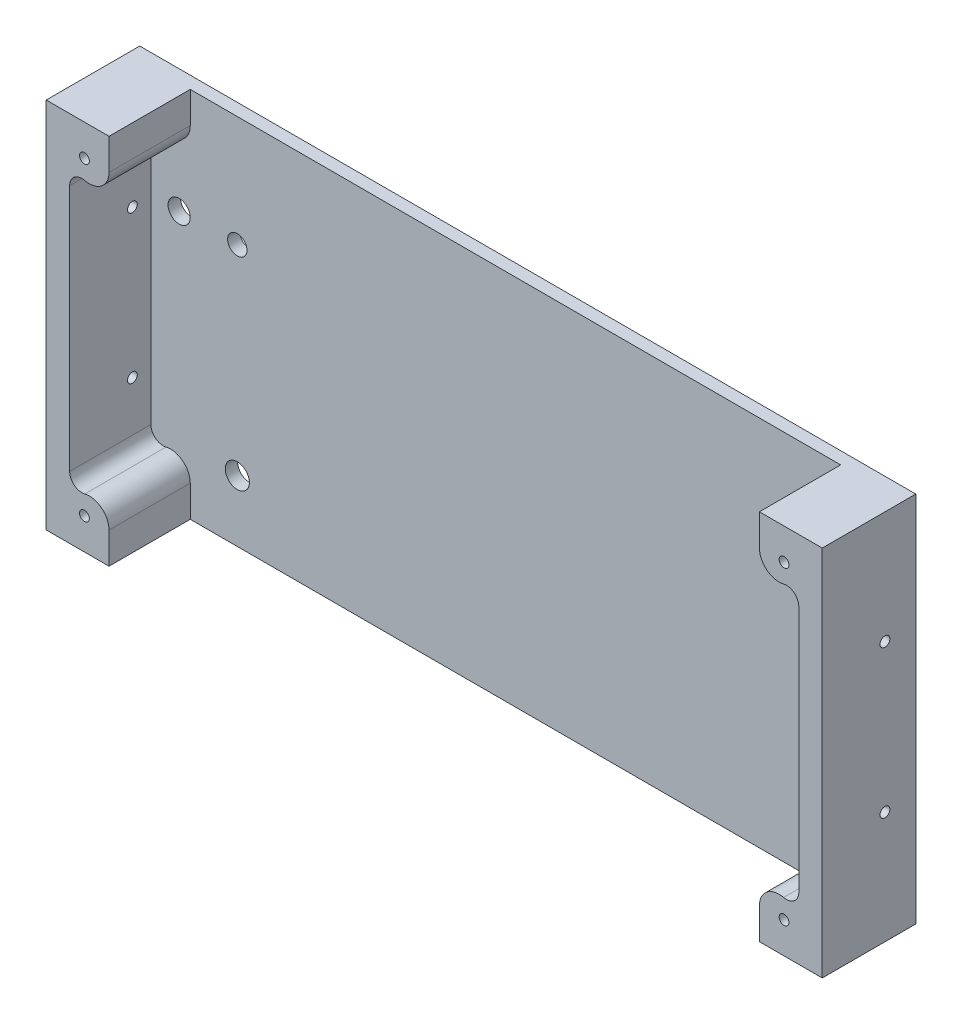
ISO-10303-21;
HEADER;
FILE_DESCRIPTION(('STEP AP214'),'2;1');
FILE_NAME('part.step','',(''),(''),'','','');
FILE_SCHEMA(('AUTOMOTIVE_DESIGN { 1 0 10303 214 1 1 1 1 }'));
ENDSEC;
DATA;
#1=APPLICATION_CONTEXT('core data for automotive mechanical design processes');
#2=APPLICATION_PROTOCOL_DEFINITION('international standard','automotive_design',2000,#1);
#3=PRODUCT_CONTEXT('',#1,'mechanical');
#4=PRODUCT('Part','Part','',(#3));
#5=PRODUCT_RELATED_PRODUCT_CATEGORY('part','',(#4));
#6=PRODUCT_DEFINITION_FORMATION('','',#4);
#7=PRODUCT_DEFINITION_CONTEXT('part definition',#1,'design');
#8=PRODUCT_DEFINITION('design','',#6,#7);
#9=PRODUCT_DEFINITION_SHAPE('','',#8);
#10=(LENGTH_UNIT() NAMED_UNIT(*) SI_UNIT(.MILLI.,.METRE.));
#11=(NAMED_UNIT(*) PLANE_ANGLE_UNIT() SI_UNIT($,.RADIAN.));
#12=(NAMED_UNIT(*) SI_UNIT($,.STERADIAN.) SOLID_ANGLE_UNIT());
#13=UNCERTAINTY_MEASURE_WITH_UNIT(LENGTH_MEASURE(1.E-05),#10,'distance_accuracy_value','');
#14=(GEOMETRIC_REPRESENTATION_CONTEXT(3) GLOBAL_UNCERTAINTY_ASSIGNED_CONTEXT((#13)) GLOBAL_UNIT_ASSIGNED_CONTEXT((#10,
#11,#12)) REPRESENTATION_CONTEXT('',''));
#15=CARTESIAN_POINT('',(0.,0.,0.));
#16=DIRECTION('',(0.,0.,1.));
#17=DIRECTION('',(1.,0.,0.));
#18=AXIS2_PLACEMENT_3D('',#15,#16,#17);
#19=CARTESIAN_POINT('',(206.607434168938,96.8446274939205,6.35));
#20=DIRECTION('',(0.,0.,1.));
#21=DIRECTION('',(1.,0.,0.));
#22=AXIS2_PLACEMENT_3D('',#19,#20,#21);
#23=PLANE('',#22);
#24=CARTESIAN_POINT('',(208.186505406018,98.304040128967,6.35));
#25=DIRECTION('',(0.,0.,1.));
#26=DIRECTION('',(1.,0.,0.));
#27=AXIS2_PLACEMENT_3D('',#24,#25,#26);
#28=CIRCLE('',#27,1.26619000000005);
#29=CARTESIAN_POINT('',(209.452695406018,98.304040128967,6.35));
#30=VERTEX_POINT('',#29);
#31=EDGE_CURVE('E19',#30,#30,#28,.F.);
#32=ORIENTED_EDGE('',*,*,#31,.F.);
#33=EDGE_LOOP('',(#32));
#34=FACE_BOUND('',#33,.T.);
#35=ADVANCED_FACE('F15',(#34),#23,.T.);
#36=CARTESIAN_POINT('',(206.894991606018,17.1041263289668,6.35));
#37=DIRECTION('',(0.,0.,1.));
#38=DIRECTION('',(1.,0.,0.));
#39=AXIS2_PLACEMENT_3D('',#36,#37,#38);
#40=PLANE('',#39);
#41=CARTESIAN_POINT('',(208.186505406018,18.3956401289667,6.35));
#42=DIRECTION('',(0.,0.,1.));
#43=DIRECTION('',(1.,0.,0.));
#44=AXIS2_PLACEMENT_3D('',#41,#42,#43);
#45=CIRCLE('',#44,1.26618999999984);
#46=CARTESIAN_POINT('',(209.452695406018,18.3956401289667,6.35));
#47=VERTEX_POINT('',#46);
#48=EDGE_CURVE('E186',#47,#47,#45,.F.);
#49=ORIENTED_EDGE('',*,*,#48,.F.);
#50=EDGE_LOOP('',(#49));
#51=FACE_BOUND('',#50,.T.);
#52=ADVANCED_FACE('F197',(#51),#40,.T.);
#53=CARTESIAN_POINT('',(206.916505406018,98.304040128967,24.13));
#54=DIRECTION('',(0.,0.,-1.));
#55=DIRECTION('',(-1.,0.,0.));
#56=AXIS2_PLACEMENT_3D('',#53,#54,#55);
#57=CYLINDRICAL_SURFACE('',#56,5.07999999999981);
#58=CARTESIAN_POINT('',(206.916505406018,98.304040128967,24.13));
#59=DIRECTION('',(0.,0.,-1.));
#60=DIRECTION('',(-1.,0.,0.));
#61=AXIS2_PLACEMENT_3D('',#58,#59,#60);
#62=CIRCLE('',#61,5.07999999999981);
#63=CARTESIAN_POINT('',(201.836505406018,98.3040401289668,24.13));
#64=VERTEX_POINT('',#63);
#65=CARTESIAN_POINT('',(208.088813098325,93.361156893996,24.13));
#66=VERTEX_POINT('',#65);
#67=EDGE_CURVE('E309',#64,#66,#62,.F.);
#68=ORIENTED_EDGE('',*,*,#67,.F.);
#69=DIRECTION('',(0.,0.,1.));
#70=VECTOR('',#69,1.);
#71=CARTESIAN_POINT('',(201.836505406018,98.3040401289667,13.6525));
#72=LINE('',#71,#70);
#73=CARTESIAN_POINT('',(201.836505406018,98.3040401289668,3.175));
#74=VERTEX_POINT('',#73);
#75=EDGE_CURVE('E361',#74,#64,#72,.T.);
#76=ORIENTED_EDGE('',*,*,#75,.F.);
#77=CARTESIAN_POINT('',(206.916505406018,98.304040128967,3.17500000000001));
#78=DIRECTION('',(0.,0.,-1.));
#79=DIRECTION('',(-1.,0.,0.));
#80=AXIS2_PLACEMENT_3D('',#77,#78,#79);
#81=CIRCLE('',#80,5.07999999999981);
#82=CARTESIAN_POINT('',(208.088813098325,93.3611568939962,3.17500000000001));
#83=VERTEX_POINT('',#82);
#84=EDGE_CURVE('E323',#83,#74,#81,.T.);
#85=ORIENTED_EDGE('',*,*,#84,.F.);
#86=DIRECTION('',(0.,0.,-1.));
#87=VECTOR('',#86,1.);
#88=CARTESIAN_POINT('',(208.088813098325,93.361156893996,13.6525));
#89=LINE('',#88,#87);
#90=EDGE_CURVE('E360',#66,#83,#89,.T.);
#91=ORIENTED_EDGE('',*,*,#90,.F.);
#92=EDGE_LOOP('',(#68,#76,#85,#91));
#93=FACE_BOUND('',#92,.T.);
#94=ADVANCED_FACE('F203',(#93),#57,.T.);
#95=CARTESIAN_POINT('',(208.821505406018,90.2718548721389,3.175));
#96=DIRECTION('',(0.,0.,1.));
#97=DIRECTION('',(1.,0.,0.));
#98=AXIS2_PLACEMENT_3D('',#95,#96,#97);
#99=CYLINDRICAL_SURFACE('',#98,3.17500000000019);
#100=CARTESIAN_POINT('',(208.821505406018,90.2718548721389,24.13));
#101=DIRECTION('',(0.,0.,1.));
#102=DIRECTION('',(1.,0.,0.));
#103=AXIS2_PLACEMENT_3D('',#100,#101,#102);
#104=CIRCLE('',#103,3.17500000000019);
#105=CARTESIAN_POINT('',(211.996505406018,90.2718548721391,24.13));
#106=VERTEX_POINT('',#105);
#107=EDGE_CURVE('E306',#66,#106,#104,.F.);
#108=ORIENTED_EDGE('',*,*,#107,.F.);
#109=ORIENTED_EDGE('',*,*,#90,.T.);
#110=CARTESIAN_POINT('',(208.821505406018,90.2718548721389,3.175));
#111=DIRECTION('',(0.,0.,1.));
#112=DIRECTION('',(1.,0.,0.));
#113=AXIS2_PLACEMENT_3D('',#110,#111,#112);
#114=CIRCLE('',#113,3.17500000000019);
#115=CARTESIAN_POINT('',(211.996505406018,90.2718548721391,3.175));
#116=VERTEX_POINT('',#115);
#117=EDGE_CURVE('E324',#116,#83,#114,.T.);
#118=ORIENTED_EDGE('',*,*,#117,.F.);
#119=DIRECTION('',(0.,0.,-1.));
#120=VECTOR('',#119,1.);
#121=CARTESIAN_POINT('',(211.996505406018,90.2718548721392,13.6525));
#122=LINE('',#121,#120);
#123=EDGE_CURVE('E358',#106,#116,#122,.T.);
#124=ORIENTED_EDGE('',*,*,#123,.F.);
#125=EDGE_LOOP('',(#108,#109,#118,#124));
#126=FACE_BOUND('',#125,.T.);
#127=ADVANCED_FACE('F453',(#126),#99,.F.);
#128=CARTESIAN_POINT('',(211.996505406018,26.4278253857947,3.175));
#129=DIRECTION('',(-1.,0.,0.));
#130=DIRECTION('',(0.,0.,1.));
#131=AXIS2_PLACEMENT_3D('',#128,#129,#130);
#132=PLANE('',#131);
#133=CARTESIAN_POINT('',(211.996505406018,39.2998401289666,7.95019999999987));
#134=DIRECTION('',(-1.,0.,0.));
#135=DIRECTION('',(0.,-1.,0.));
#136=AXIS2_PLACEMENT_3D('',#133,#134,#135);
#137=CIRCLE('',#136,1.27);
#138=CARTESIAN_POINT('',(211.996505406018,38.0298401289666,7.95019999999987));
#139=VERTEX_POINT('',#138);
#140=EDGE_CURVE('E181',#139,#139,#137,.T.);
#141=ORIENTED_EDGE('',*,*,#140,.F.);
#142=EDGE_LOOP('',(#141));
#143=FACE_BOUND('',#142,.T.);
#144=CARTESIAN_POINT('',(211.996505406018,77.3998401289666,7.95019999999987));
#145=DIRECTION('',(-1.,0.,0.));
#146=DIRECTION('',(0.,0.,1.));
#147=AXIS2_PLACEMENT_3D('',#144,#145,#146);
#148=CIRCLE('',#147,1.27);
#149=CARTESIAN_POINT('',(211.996505406018,77.3998401289666,9.22019999999987));
#150=VERTEX_POINT('',#149);
#151=EDGE_CURVE('E184',#150,#150,#148,.T.);
#152=ORIENTED_EDGE('',*,*,#151,.F.);
#153=EDGE_LOOP('',(#152));
#154=FACE_BOUND('',#153,.T.);
#155=DIRECTION('',(0.,-1.,0.));
#156=VECTOR('',#155,1.);
#157=CARTESIAN_POINT('',(211.996505406018,58.3498401289668,24.13));
#158=LINE('',#157,#156);
#159=CARTESIAN_POINT('',(211.996505406018,26.4278253857947,24.13));
#160=VERTEX_POINT('',#159);
#161=EDGE_CURVE('E305',#106,#160,#158,.T.);
#162=ORIENTED_EDGE('',*,*,#161,.F.);
#163=ORIENTED_EDGE('',*,*,#123,.T.);
#164=DIRECTION('',(0.,1.,0.));
#165=VECTOR('',#164,1.);
#166=CARTESIAN_POINT('',(211.996505406018,58.3498401289668,3.175));
#167=LINE('',#166,#165);
#168=CARTESIAN_POINT('',(211.996505406018,26.4278253857947,3.175));
#169=VERTEX_POINT('',#168);
#170=EDGE_CURVE('E172',#169,#116,#167,.T.);
#171=ORIENTED_EDGE('',*,*,#170,.F.);
#172=DIRECTION('',(0.,0.,-1.));
#173=VECTOR('',#172,1.);
#174=CARTESIAN_POINT('',(211.996505406018,26.4278253857947,13.6525));
#175=LINE('',#174,#173);
#176=EDGE_CURVE('E164',#160,#169,#175,.T.);
#177=ORIENTED_EDGE('',*,*,#176,.F.);
#178=EDGE_LOOP('',(#162,#163,#171,#177));
#179=FACE_BOUND('',#178,.T.);
#180=ADVANCED_FACE('F451',(#143,#154,#179),#132,.T.);
#181=CARTESIAN_POINT('',(208.821505406018,26.4278253857946,3.175));
#182=DIRECTION('',(0.,0.,1.));
#183=DIRECTION('',(0.,-1.,0.));
#184=AXIS2_PLACEMENT_3D('',#181,#182,#183);
#185=CYLINDRICAL_SURFACE('',#184,3.175);
#186=CARTESIAN_POINT('',(208.821505406018,26.4278253857946,24.13));
#187=DIRECTION('',(0.,0.,1.));
#188=DIRECTION('',(0.,-1.,0.));
#189=AXIS2_PLACEMENT_3D('',#186,#187,#188);
#190=CIRCLE('',#189,3.175);
#191=CARTESIAN_POINT('',(208.088813098326,23.3385233639378,24.13));
#192=VERTEX_POINT('',#191);
#193=EDGE_CURVE('E303',#160,#192,#190,.F.);
#194=ORIENTED_EDGE('',*,*,#193,.F.);
#195=ORIENTED_EDGE('',*,*,#176,.T.);
#196=CARTESIAN_POINT('',(208.821505406018,26.4278253857946,3.175));
#197=DIRECTION('',(0.,0.,1.));
#198=DIRECTION('',(0.,-1.,0.));
#199=AXIS2_PLACEMENT_3D('',#196,#197,#198);
#200=CIRCLE('',#199,3.175);
#201=CARTESIAN_POINT('',(208.088813098326,23.3385233639378,3.175));
#202=VERTEX_POINT('',#201);
#203=EDGE_CURVE('E167',#202,#169,#200,.T.);
#204=ORIENTED_EDGE('',*,*,#203,.F.);
#205=DIRECTION('',(0.,0.,-1.));
#206=VECTOR('',#205,1.);
#207=CARTESIAN_POINT('',(208.088813098326,23.3385233639378,13.6525));
#208=LINE('',#207,#206);
#209=EDGE_CURVE('E153',#192,#202,#208,.T.);
#210=ORIENTED_EDGE('',*,*,#209,.F.);
#211=EDGE_LOOP('',(#194,#195,#204,#210));
#212=FACE_BOUND('',#211,.T.);
#213=ADVANCED_FACE('F168',(#212),#185,.F.);
#214=CARTESIAN_POINT('',(206.916505406018,18.3956401289665,24.13));
#215=DIRECTION('',(0.,0.,-1.));
#216=DIRECTION('',(0.,1.,0.));
#217=AXIS2_PLACEMENT_3D('',#214,#215,#216);
#218=CYLINDRICAL_SURFACE('',#217,5.08000000000038);
#219=CARTESIAN_POINT('',(206.916505406018,18.3956401289665,24.13));
#220=DIRECTION('',(0.,0.,-1.));
#221=DIRECTION('',(0.,1.,0.));
#222=AXIS2_PLACEMENT_3D('',#219,#220,#221);
#223=CIRCLE('',#222,5.08000000000038);
#224=CARTESIAN_POINT('',(201.836505406018,18.3956401289667,24.13));
#225=VERTEX_POINT('',#224);
#226=EDGE_CURVE('E160',#192,#225,#223,.F.);
#227=ORIENTED_EDGE('',*,*,#226,.F.);
#228=ORIENTED_EDGE('',*,*,#209,.T.);
#229=CARTESIAN_POINT('',(206.916505406018,18.3956401289666,3.17499999999999));
#230=DIRECTION('',(0.,0.,-1.));
#231=DIRECTION('',(0.,1.,0.));
#232=AXIS2_PLACEMENT_3D('',#229,#230,#231);
#233=CIRCLE('',#232,5.08000000000038);
#234=CARTESIAN_POINT('',(201.836505406018,18.3956401289668,3.17499999999999));
#235=VERTEX_POINT('',#234);
#236=EDGE_CURVE('E157',#235,#202,#233,.T.);
#237=ORIENTED_EDGE('',*,*,#236,.F.);
#238=DIRECTION('',(0.,0.,-1.));
#239=VECTOR('',#238,1.);
#240=CARTESIAN_POINT('',(201.836505406018,18.3956401289669,13.6525));
#241=LINE('',#240,#239);
#242=EDGE_CURVE('E148',#225,#235,#241,.T.);
#243=ORIENTED_EDGE('',*,*,#242,.F.);
#244=EDGE_LOOP('',(#227,#228,#237,#243));
#245=FACE_BOUND('',#244,.T.);
#246=ADVANCED_FACE('F155',(#245),#218,.T.);
#247=CARTESIAN_POINT('',(208.186505406018,98.304040128967,6.35));
#248=DIRECTION('',(0.,0.,1.));
#249=DIRECTION('',(1.,0.,0.));
#250=AXIS2_PLACEMENT_3D('',#247,#248,#249);
#251=CYLINDRICAL_SURFACE('',#250,1.26619000000005);
#252=ORIENTED_EDGE('',*,*,#31,.T.);
#253=EDGE_LOOP('',(#252));
#254=FACE_BOUND('',#253,.T.);
#255=CARTESIAN_POINT('',(208.186505406018,98.304040128967,24.13));
#256=DIRECTION('',(0.,0.,1.));
#257=DIRECTION('',(1.,0.,0.));
#258=AXIS2_PLACEMENT_3D('',#255,#256,#257);
#259=CIRCLE('',#258,1.26619000000005);
#260=CARTESIAN_POINT('',(209.452695406018,98.304040128967,24.13));
#261=VERTEX_POINT('',#260);
#262=EDGE_CURVE('E298',#261,#261,#259,.F.);
#263=ORIENTED_EDGE('',*,*,#262,.F.);
#264=EDGE_LOOP('',(#263));
#265=FACE_BOUND('',#264,.T.);
#266=ADVANCED_FACE('F193',(#254,#265),#251,.F.);
#267=CARTESIAN_POINT('',(208.186505406018,18.3956401289667,6.35));
#268=DIRECTION('',(0.,0.,1.));
#269=DIRECTION('',(1.,0.,0.));
#270=AXIS2_PLACEMENT_3D('',#267,#268,#269);
#271=CYLINDRICAL_SURFACE('',#270,1.26618999999984);
#272=CARTESIAN_POINT('',(208.186505406018,18.3956401289667,24.13));
#273=DIRECTION('',(0.,0.,1.));
#274=DIRECTION('',(1.,0.,0.));
#275=AXIS2_PLACEMENT_3D('',#272,#273,#274);
#276=CIRCLE('',#275,1.26618999999984);
#277=CARTESIAN_POINT('',(209.452695406018,18.3956401289667,24.13));
#278=VERTEX_POINT('',#277);
#279=EDGE_CURVE('E295',#278,#278,#276,.F.);
#280=ORIENTED_EDGE('',*,*,#279,.F.);
#281=EDGE_LOOP('',(#280));
#282=FACE_BOUND('',#281,.T.);
#283=ORIENTED_EDGE('',*,*,#48,.T.);
#284=EDGE_LOOP('',(#283));
#285=FACE_BOUND('',#284,.T.);
#286=ADVANCED_FACE('F665',(#282,#285),#271,.F.);
#287=CARTESIAN_POINT('',(218.041705406018,77.3998401289667,7.9502));
#288=DIRECTION('',(-1.,0.,0.));
#289=DIRECTION('',(0.,0.,1.));
#290=AXIS2_PLACEMENT_3D('',#287,#288,#289);
#291=CYLINDRICAL_SURFACE('',#290,1.27);
#292=ORIENTED_EDGE('',*,*,#151,.T.);
#293=EDGE_LOOP('',(#292));
#294=FACE_BOUND('',#293,.T.);
#295=CARTESIAN_POINT('',(218.041705406018,77.3998401289667,7.9502));
#296=DIRECTION('',(-1.,0.,0.));
#297=DIRECTION('',(0.,0.,1.));
#298=AXIS2_PLACEMENT_3D('',#295,#296,#297);
#299=CIRCLE('',#298,1.27);
#300=CARTESIAN_POINT('',(218.041705406018,77.3998401289667,9.2202));
#301=VERTEX_POINT('',#300);
#302=EDGE_CURVE('E291',#301,#301,#299,.T.);
#303=ORIENTED_EDGE('',*,*,#302,.F.);
#304=EDGE_LOOP('',(#303));
#305=FACE_BOUND('',#304,.T.);
#306=ADVANCED_FACE('F657',(#294,#305),#291,.F.);
#307=CARTESIAN_POINT('',(218.041705406018,39.2998401289667,7.9502));
#308=DIRECTION('',(-1.,0.,0.));
#309=DIRECTION('',(0.,-1.,0.));
#310=AXIS2_PLACEMENT_3D('',#307,#308,#309);
#311=CYLINDRICAL_SURFACE('',#310,1.27);
#312=ORIENTED_EDGE('',*,*,#140,.T.);
#313=EDGE_LOOP('',(#312));
#314=FACE_BOUND('',#313,.T.);
#315=CARTESIAN_POINT('',(218.041705406018,39.2998401289667,7.9502));
#316=DIRECTION('',(-1.,0.,0.));
#317=DIRECTION('',(0.,-1.,0.));
#318=AXIS2_PLACEMENT_3D('',#315,#316,#317);
#319=CIRCLE('',#318,1.27);
#320=CARTESIAN_POINT('',(218.041705406018,38.0298401289667,7.9502));
#321=VERTEX_POINT('',#320);
#322=EDGE_CURVE('E288',#321,#321,#319,.T.);
#323=ORIENTED_EDGE('',*,*,#322,.F.);
#324=EDGE_LOOP('',(#323));
#325=FACE_BOUND('',#324,.T.);
#326=ADVANCED_FACE('F649',(#314,#325),#311,.F.);
#327=CARTESIAN_POINT('',(46.182355604066,77.7300401289667,0.));
#328=DIRECTION('',(0.,0.,1.));
#329=DIRECTION('',(1.,0.,0.));
#330=AXIS2_PLACEMENT_3D('',#327,#328,#329);
#331=CYLINDRICAL_SURFACE('',#330,2.49602782548072);
#332=CARTESIAN_POINT('',(46.182355604066,77.7300401289667,0.));
#333=DIRECTION('',(0.,0.,1.));
#334=DIRECTION('',(1.,0.,0.));
#335=AXIS2_PLACEMENT_3D('',#332,#333,#334);
#336=CIRCLE('',#335,2.49602782548072);
#337=CARTESIAN_POINT('',(48.6783834295467,77.7300401289667,0.));
#338=VERTEX_POINT('',#337);
#339=EDGE_CURVE('E284',#338,#338,#336,.T.);
#340=ORIENTED_EDGE('',*,*,#339,.F.);
#341=EDGE_LOOP('',(#340));
#342=FACE_BOUND('',#341,.T.);
#343=CARTESIAN_POINT('',(46.182355604066,77.7300401289667,3.175));
#344=DIRECTION('',(0.,0.,1.));
#345=DIRECTION('',(1.,0.,0.));
#346=AXIS2_PLACEMENT_3D('',#343,#344,#345);
#347=CIRCLE('',#346,2.49602782548072);
#348=CARTESIAN_POINT('',(48.6783834295467,77.7300401289667,3.175));
#349=VERTEX_POINT('',#348);
#350=EDGE_CURVE('E313',#349,#349,#347,.F.);
#351=ORIENTED_EDGE('',*,*,#350,.F.);
#352=EDGE_LOOP('',(#351));
#353=FACE_BOUND('',#352,.T.);
#354=ADVANCED_FACE('F641',(#342,#353),#331,.F.);
#355=CARTESIAN_POINT('',(46.182355604066,26.1426401289667,0.));
#356=DIRECTION('',(0.,0.,1.));
#357=DIRECTION('',(1.,0.,0.));
#358=AXIS2_PLACEMENT_3D('',#355,#356,#357);
#359=CYLINDRICAL_SURFACE('',#358,3.1115);
#360=CARTESIAN_POINT('',(46.182355604066,26.1426401289667,0.));
#361=DIRECTION('',(0.,0.,1.));
#362=DIRECTION('',(1.,0.,0.));
#363=AXIS2_PLACEMENT_3D('',#360,#361,#362);
#364=CIRCLE('',#363,3.1115);
#365=CARTESIAN_POINT('',(49.293855604066,26.1426401289667,0.));
#366=VERTEX_POINT('',#365);
#367=EDGE_CURVE('E281',#366,#366,#364,.T.);
#368=ORIENTED_EDGE('',*,*,#367,.F.);
#369=EDGE_LOOP('',(#368));
#370=FACE_BOUND('',#369,.T.);
#371=CARTESIAN_POINT('',(46.182355604066,26.1426401289667,3.175));
#372=DIRECTION('',(0.,0.,1.));
#373=DIRECTION('',(1.,0.,0.));
#374=AXIS2_PLACEMENT_3D('',#371,#372,#373);
#375=CIRCLE('',#374,3.1115);
#376=CARTESIAN_POINT('',(49.293855604066,26.1426401289667,3.175));
#377=VERTEX_POINT('',#376);
#378=EDGE_CURVE('E317',#377,#377,#375,.F.);
#379=ORIENTED_EDGE('',*,*,#378,.F.);
#380=EDGE_LOOP('',(#379));
#381=FACE_BOUND('',#380,.T.);
#382=ADVANCED_FACE('F633',(#370,#381),#359,.F.);
#383=CARTESIAN_POINT('',(31.178575604066,77.7300401289667,0.));
#384=DIRECTION('',(0.,0.,1.));
#385=DIRECTION('',(1.,0.,0.));
#386=AXIS2_PLACEMENT_3D('',#383,#384,#385);
#387=CYLINDRICAL_SURFACE('',#386,2.864203424347);
#388=CARTESIAN_POINT('',(31.178575604066,77.7300401289667,0.));
#389=DIRECTION('',(0.,0.,1.));
#390=DIRECTION('',(1.,0.,0.));
#391=AXIS2_PLACEMENT_3D('',#388,#389,#390);
#392=CIRCLE('',#391,2.864203424347);
#393=CARTESIAN_POINT('',(34.042779028413,77.7300401289667,0.));
#394=VERTEX_POINT('',#393);
#395=EDGE_CURVE('E278',#394,#394,#392,.T.);
#396=ORIENTED_EDGE('',*,*,#395,.F.);
#397=EDGE_LOOP('',(#396));
#398=FACE_BOUND('',#397,.T.);
#399=CARTESIAN_POINT('',(31.178575604066,77.7300401289667,3.175));
#400=DIRECTION('',(0.,0.,1.));
#401=DIRECTION('',(1.,0.,0.));
#402=AXIS2_PLACEMENT_3D('',#399,#400,#401);
#403=CIRCLE('',#402,2.864203424347);
#404=CARTESIAN_POINT('',(34.042779028413,77.7300401289667,3.175));
#405=VERTEX_POINT('',#404);
#406=EDGE_CURVE('E320',#405,#405,#403,.F.);
#407=ORIENTED_EDGE('',*,*,#406,.F.);
#408=EDGE_LOOP('',(#407));
#409=FACE_BOUND('',#408,.T.);
#410=ADVANCED_FACE('F626',(#398,#409),#387,.F.);
#411=CARTESIAN_POINT('',(201.836505406018,10.3184401289668,3.175));
#412=DIRECTION('',(-1.,0.,0.));
#413=DIRECTION('',(0.,0.,1.));
#414=AXIS2_PLACEMENT_3D('',#411,#412,#413);
#415=PLANE('',#414);
#416=DIRECTION('',(0.,-1.,0.));
#417=VECTOR('',#416,1.);
#418=CARTESIAN_POINT('',(201.836505406018,58.3498401289668,24.13));
#419=LINE('',#418,#417);
#420=CARTESIAN_POINT('',(201.836505406018,10.3184401289668,24.13));
#421=VERTEX_POINT('',#420);
#422=EDGE_CURVE('E301',#225,#421,#419,.T.);
#423=ORIENTED_EDGE('',*,*,#422,.F.);
#424=ORIENTED_EDGE('',*,*,#242,.T.);
#425=DIRECTION('',(0.,1.,0.));
#426=VECTOR('',#425,1.);
#427=CARTESIAN_POINT('',(201.836505406018,58.3498401289668,3.175));
#428=LINE('',#427,#426);
#429=CARTESIAN_POINT('',(201.836505406018,10.3184401289668,3.175));
#430=VERTEX_POINT('',#429);
#431=EDGE_CURVE('E176',#430,#235,#428,.T.);
#432=ORIENTED_EDGE('',*,*,#431,.F.);
#433=DIRECTION('',(0.,0.,-1.));
#434=VECTOR('',#433,1.);
#435=CARTESIAN_POINT('',(201.836505406018,10.3184401289668,12.065));
#436=LINE('',#435,#434);
#437=EDGE_CURVE('E344',#421,#430,#436,.T.);
#438=ORIENTED_EDGE('',*,*,#437,.F.);
#439=EDGE_LOOP('',(#423,#424,#432,#438));
#440=FACE_BOUND('',#439,.T.);
#441=ADVANCED_FACE('F445',(#440),#415,.T.);
#442=CARTESIAN_POINT('',(17.8389054060178,77.3998401289667,7.9502));
#443=DIRECTION('',(1.,0.,0.));
#444=DIRECTION('',(0.,0.,-1.));
#445=AXIS2_PLACEMENT_3D('',#442,#443,#444);
#446=CYLINDRICAL_SURFACE('',#445,1.27);
#447=CARTESIAN_POINT('',(23.8841054060178,77.3998401289667,7.9502));
#448=DIRECTION('',(1.,0.,0.));
#449=DIRECTION('',(0.,0.,-1.));
#450=AXIS2_PLACEMENT_3D('',#447,#448,#449);
#451=CIRCLE('',#450,1.27);
#452=CARTESIAN_POINT('',(23.8841054060178,77.3998401289667,6.6802));
#453=VERTEX_POINT('',#452);
#454=EDGE_CURVE('E257',#453,#453,#451,.F.);
#455=ORIENTED_EDGE('',*,*,#454,.F.);
#456=EDGE_LOOP('',(#455));
#457=FACE_BOUND('',#456,.T.);
#458=CARTESIAN_POINT('',(17.8389054060178,77.3998401289667,7.9502));
#459=DIRECTION('',(1.,0.,0.));
#460=DIRECTION('',(0.,0.,-1.));
#461=AXIS2_PLACEMENT_3D('',#458,#459,#460);
#462=CIRCLE('',#461,1.27);
#463=CARTESIAN_POINT('',(17.8389054060178,77.3998401289667,6.6802));
#464=VERTEX_POINT('',#463);
#465=EDGE_CURVE('E270',#464,#464,#462,.T.);
#466=ORIENTED_EDGE('',*,*,#465,.F.);
#467=EDGE_LOOP('',(#466));
#468=FACE_BOUND('',#467,.T.);
#469=ADVANCED_FACE('F611',(#457,#468),#446,.F.);
#470=CARTESIAN_POINT('',(17.8389054060178,39.2998401289667,7.9502));
#471=DIRECTION('',(1.,0.,0.));
#472=DIRECTION('',(0.,0.,-1.));
#473=AXIS2_PLACEMENT_3D('',#470,#471,#472);
#474=CYLINDRICAL_SURFACE('',#473,1.27);
#475=CARTESIAN_POINT('',(23.8841054060177,39.2998401289667,7.9502));
#476=DIRECTION('',(1.,0.,0.));
#477=DIRECTION('',(0.,0.,-1.));
#478=AXIS2_PLACEMENT_3D('',#475,#476,#477);
#479=CIRCLE('',#478,1.27);
#480=CARTESIAN_POINT('',(23.8841054060177,39.2998401289667,6.6802));
#481=VERTEX_POINT('',#480);
#482=EDGE_CURVE('E254',#481,#481,#479,.F.);
#483=ORIENTED_EDGE('',*,*,#482,.F.);
#484=EDGE_LOOP('',(#483));
#485=FACE_BOUND('',#484,.T.);
#486=CARTESIAN_POINT('',(17.8389054060178,39.2998401289667,7.9502));
#487=DIRECTION('',(1.,0.,0.));
#488=DIRECTION('',(0.,0.,-1.));
#489=AXIS2_PLACEMENT_3D('',#486,#487,#488);
#490=CIRCLE('',#489,1.27);
#491=CARTESIAN_POINT('',(17.8389054060178,39.2998401289667,6.6802));
#492=VERTEX_POINT('',#491);
#493=EDGE_CURVE('E274',#492,#492,#490,.T.);
#494=ORIENTED_EDGE('',*,*,#493,.F.);
#495=EDGE_LOOP('',(#494));
#496=FACE_BOUND('',#495,.T.);
#497=ADVANCED_FACE('F603',(#485,#496),#474,.F.);
#498=CARTESIAN_POINT('',(23.8841054060177,10.3184401289668,3.175));
#499=DIRECTION('',(0.,0.,1.));
#500=DIRECTION('',(1.,0.,0.));
#501=AXIS2_PLACEMENT_3D('',#498,#499,#500);
#502=PLANE('',#501);
#503=ORIENTED_EDGE('',*,*,#350,.T.);
#504=EDGE_LOOP('',(#503));
#505=FACE_BOUND('',#504,.T.);
#506=ORIENTED_EDGE('',*,*,#378,.T.);
#507=EDGE_LOOP('',(#506));
#508=FACE_BOUND('',#507,.T.);
#509=ORIENTED_EDGE('',*,*,#406,.T.);
#510=EDGE_LOOP('',(#509));
#511=FACE_BOUND('',#510,.T.);
#512=CARTESIAN_POINT('',(28.9641054060177,18.3956401289668,3.175));
#513=DIRECTION('',(0.,0.,-1.));
#514=DIRECTION('',(-1.,0.,0.));
#515=AXIS2_PLACEMENT_3D('',#512,#513,#514);
#516=CIRCLE('',#515,5.08000000000005);
#517=CARTESIAN_POINT('',(34.0441054060178,18.3956401289668,3.175));
#518=VERTEX_POINT('',#517);
#519=CARTESIAN_POINT('',(27.79179771371,23.3385233639377,3.175));
#520=VERTEX_POINT('',#519);
#521=EDGE_CURVE('E266',#518,#520,#516,.F.);
#522=ORIENTED_EDGE('',*,*,#521,.F.);
#523=DIRECTION('',(0.,1.,0.));
#524=VECTOR('',#523,1.);
#525=CARTESIAN_POINT('',(34.0441054060178,14.3570401289668,3.175));
#526=LINE('',#525,#524);
#527=CARTESIAN_POINT('',(34.0441054060178,10.3184401289668,3.175));
#528=VERTEX_POINT('',#527);
#529=EDGE_CURVE('E338',#528,#518,#526,.T.);
#530=ORIENTED_EDGE('',*,*,#529,.F.);
#531=DIRECTION('',(-1.,0.,0.));
#532=VECTOR('',#531,1.);
#533=CARTESIAN_POINT('',(117.940305406018,10.3184401289668,3.175));
#534=LINE('',#533,#532);
#535=EDGE_CURVE('E341',#430,#528,#534,.T.);
#536=ORIENTED_EDGE('',*,*,#535,.F.);
#537=ORIENTED_EDGE('',*,*,#431,.T.);
#538=ORIENTED_EDGE('',*,*,#236,.T.);
#539=ORIENTED_EDGE('',*,*,#203,.T.);
#540=ORIENTED_EDGE('',*,*,#170,.T.);
#541=ORIENTED_EDGE('',*,*,#117,.T.);
#542=ORIENTED_EDGE('',*,*,#84,.T.);
#543=DIRECTION('',(0.,-1.,0.));
#544=VECTOR('',#543,1.);
#545=CARTESIAN_POINT('',(201.836505406018,102.342640128967,3.175));
#546=LINE('',#545,#544);
#547=CARTESIAN_POINT('',(201.836505406018,106.381240128967,3.175));
#548=VERTEX_POINT('',#547);
#549=EDGE_CURVE('E316',#548,#74,#546,.T.);
#550=ORIENTED_EDGE('',*,*,#549,.F.);
#551=DIRECTION('',(1.,0.,0.));
#552=VECTOR('',#551,1.);
#553=CARTESIAN_POINT('',(117.940305406018,106.381240128967,3.175));
#554=LINE('',#553,#552);
#555=CARTESIAN_POINT('',(34.0441054060178,106.381240128967,3.175));
#556=VERTEX_POINT('',#555);
#557=EDGE_CURVE('E329',#556,#548,#554,.T.);
#558=ORIENTED_EDGE('',*,*,#557,.F.);
#559=DIRECTION('',(0.,1.,0.));
#560=VECTOR('',#559,1.);
#561=CARTESIAN_POINT('',(34.0441054060178,102.342640128967,3.175));
#562=LINE('',#561,#560);
#563=CARTESIAN_POINT('',(34.0441054060177,98.3040401289667,3.17500000000001));
#564=VERTEX_POINT('',#563);
#565=EDGE_CURVE('E332',#564,#556,#562,.T.);
#566=ORIENTED_EDGE('',*,*,#565,.F.);
#567=CARTESIAN_POINT('',(28.9641054060177,98.3040401289668,3.17500000000001));
#568=DIRECTION('',(0.,0.,-1.));
#569=DIRECTION('',(0.,1.,0.));
#570=AXIS2_PLACEMENT_3D('',#567,#568,#569);
#571=CIRCLE('',#570,5.07999999999987);
#572=CARTESIAN_POINT('',(27.7917977137101,93.361156893996,3.175));
#573=VERTEX_POINT('',#572);
#574=EDGE_CURVE('E246',#573,#564,#571,.F.);
#575=ORIENTED_EDGE('',*,*,#574,.F.);
#576=CARTESIAN_POINT('',(27.059105406018,90.2718548721388,3.175));
#577=DIRECTION('',(0.,0.,1.));
#578=DIRECTION('',(1.,0.,0.));
#579=AXIS2_PLACEMENT_3D('',#576,#577,#578);
#580=CIRCLE('',#579,3.17500000000042);
#581=CARTESIAN_POINT('',(23.8841054060178,90.2718548721389,3.175));
#582=VERTEX_POINT('',#581);
#583=EDGE_CURVE('E251',#582,#573,#580,.F.);
#584=ORIENTED_EDGE('',*,*,#583,.F.);
#585=DIRECTION('',(0.,1.,0.));
#586=VECTOR('',#585,1.);
#587=CARTESIAN_POINT('',(23.8841054060178,58.3498401289668,3.175));
#588=LINE('',#587,#586);
#589=CARTESIAN_POINT('',(23.8841054060177,26.4278253857944,3.175));
#590=VERTEX_POINT('',#589);
#591=EDGE_CURVE('E335',#590,#582,#588,.T.);
#592=ORIENTED_EDGE('',*,*,#591,.F.);
#593=CARTESIAN_POINT('',(27.0591054060176,26.4278253857944,3.175));
#594=DIRECTION('',(0.,0.,1.));
#595=DIRECTION('',(1.,0.,0.));
#596=AXIS2_PLACEMENT_3D('',#593,#594,#595);
#597=CIRCLE('',#596,3.17499999999995);
#598=EDGE_CURVE('E261',#520,#590,#597,.F.);
#599=ORIENTED_EDGE('',*,*,#598,.F.);
#600=EDGE_LOOP('',(#522,#530,#536,#537,#538,#539,#540,#541,#542,#550,#558,#566,#575,#584,#592,#599));
#601=FACE_BOUND('',#600,.T.);
#602=ADVANCED_FACE('F174',(#505,#508,#511,#601),#502,.T.);
#603=CARTESIAN_POINT('',(201.836505406018,98.3040401289667,3.175));
#604=DIRECTION('',(-1.,0.,0.));
#605=DIRECTION('',(0.,0.,1.));
#606=AXIS2_PLACEMENT_3D('',#603,#604,#605);
#607=PLANE('',#606);
#608=DIRECTION('',(0.,-1.,0.));
#609=VECTOR('',#608,1.);
#610=CARTESIAN_POINT('',(201.836505406018,58.3498401289668,24.13));
#611=LINE('',#610,#609);
#612=CARTESIAN_POINT('',(201.836505406018,106.381240128967,24.13));
#613=VERTEX_POINT('',#612);
#614=EDGE_CURVE('E312',#613,#64,#611,.T.);
#615=ORIENTED_EDGE('',*,*,#614,.F.);
#616=DIRECTION('',(0.,0.,1.));
#617=VECTOR('',#616,1.);
#618=CARTESIAN_POINT('',(201.836505406018,106.381240128967,12.065));
#619=LINE('',#618,#617);
#620=EDGE_CURVE('E370',#548,#613,#619,.T.);
#621=ORIENTED_EDGE('',*,*,#620,.F.);
#622=ORIENTED_EDGE('',*,*,#549,.T.);
#623=ORIENTED_EDGE('',*,*,#75,.T.);
#624=EDGE_LOOP('',(#615,#621,#622,#623));
#625=FACE_BOUND('',#624,.T.);
#626=ADVANCED_FACE('F457',(#625),#607,.T.);
#627=CARTESIAN_POINT('',(201.836505406018,10.3184401289668,24.13));
#628=DIRECTION('',(0.,0.,1.));
#629=DIRECTION('',(1.,0.,0.));
#630=AXIS2_PLACEMENT_3D('',#627,#628,#629);
#631=PLANE('',#630);
#632=ORIENTED_EDGE('',*,*,#279,.T.);
#633=EDGE_LOOP('',(#632));
#634=FACE_BOUND('',#633,.T.);
#635=ORIENTED_EDGE('',*,*,#262,.T.);
#636=EDGE_LOOP('',(#635));
#637=FACE_BOUND('',#636,.T.);
#638=DIRECTION('',(0.,-1.,0.));
#639=VECTOR('',#638,1.);
#640=CARTESIAN_POINT('',(218.041705406018,58.3498401289668,24.13));
#641=LINE('',#640,#639);
#642=CARTESIAN_POINT('',(218.041705406018,106.381240128967,24.13));
#643=VERTEX_POINT('',#642);
#644=CARTESIAN_POINT('',(218.041705406018,10.3184401289668,24.13));
#645=VERTEX_POINT('',#644);
#646=EDGE_CURVE('E294',#643,#645,#641,.T.);
#647=ORIENTED_EDGE('',*,*,#646,.F.);
#648=DIRECTION('',(1.,0.,0.));
#649=VECTOR('',#648,1.);
#650=CARTESIAN_POINT('',(117.940305406018,106.381240128967,24.13));
#651=LINE('',#650,#649);
#652=EDGE_CURVE('E372',#613,#643,#651,.T.);
#653=ORIENTED_EDGE('',*,*,#652,.F.);
#654=ORIENTED_EDGE('',*,*,#614,.T.);
#655=ORIENTED_EDGE('',*,*,#67,.T.);
#656=ORIENTED_EDGE('',*,*,#107,.T.);
#657=ORIENTED_EDGE('',*,*,#161,.T.);
#658=ORIENTED_EDGE('',*,*,#193,.T.);
#659=ORIENTED_EDGE('',*,*,#226,.T.);
#660=ORIENTED_EDGE('',*,*,#422,.T.);
#661=DIRECTION('',(-1.,0.,0.));
#662=VECTOR('',#661,1.);
#663=CARTESIAN_POINT('',(117.940305406018,10.3184401289668,24.13));
#664=LINE('',#663,#662);
#665=EDGE_CURVE('E347',#645,#421,#664,.T.);
#666=ORIENTED_EDGE('',*,*,#665,.F.);
#667=EDGE_LOOP('',(#647,#653,#654,#655,#656,#657,#658,#659,#660,#666));
#668=FACE_BOUND('',#667,.T.);
#669=ADVANCED_FACE('F447',(#634,#637,#668),#631,.T.);
#670=CARTESIAN_POINT('',(218.041705406018,10.3184401289668,24.13));
#671=DIRECTION('',(1.,0.,0.));
#672=DIRECTION('',(0.,0.,-1.));
#673=AXIS2_PLACEMENT_3D('',#670,#671,#672);
#674=PLANE('',#673);
#675=ORIENTED_EDGE('',*,*,#322,.T.);
#676=EDGE_LOOP('',(#675));
#677=FACE_BOUND('',#676,.T.);
#678=ORIENTED_EDGE('',*,*,#302,.T.);
#679=EDGE_LOOP('',(#678));
#680=FACE_BOUND('',#679,.T.);
#681=DIRECTION('',(0.,0.,-1.));
#682=VECTOR('',#681,1.);
#683=CARTESIAN_POINT('',(218.041705406018,106.381240128967,12.065));
#684=LINE('',#683,#682);
#685=CARTESIAN_POINT('',(218.041705406018,106.381240128967,0.));
#686=VERTEX_POINT('',#685);
#687=EDGE_CURVE('E379',#643,#686,#684,.T.);
#688=ORIENTED_EDGE('',*,*,#687,.F.);
#689=ORIENTED_EDGE('',*,*,#646,.T.);
#690=DIRECTION('',(0.,0.,1.));
#691=VECTOR('',#690,1.);
#692=CARTESIAN_POINT('',(218.041705406018,10.3184401289668,12.065));
#693=LINE('',#692,#691);
#694=CARTESIAN_POINT('',(218.041705406018,10.3184401289668,0.));
#695=VERTEX_POINT('',#694);
#696=EDGE_CURVE('E350',#695,#645,#693,.T.);
#697=ORIENTED_EDGE('',*,*,#696,.F.);
#698=DIRECTION('',(0.,-1.,0.));
#699=VECTOR('',#698,1.);
#700=CARTESIAN_POINT('',(218.041705406018,58.3498401289668,0.));
#701=LINE('',#700,#699);
#702=EDGE_CURVE('E287',#686,#695,#701,.T.);
#703=ORIENTED_EDGE('',*,*,#702,.F.);
#704=EDGE_LOOP('',(#688,#689,#697,#703));
#705=FACE_BOUND('',#704,.T.);
#706=ADVANCED_FACE('F472',(#677,#680,#705),#674,.T.);
#707=CARTESIAN_POINT('',(218.041705406018,10.3184401289668,0.));
#708=DIRECTION('',(0.,0.,-1.));
#709=DIRECTION('',(-1.,0.,0.));
#710=AXIS2_PLACEMENT_3D('',#707,#708,#709);
#711=PLANE('',#710);
#712=ORIENTED_EDGE('',*,*,#395,.T.);
#713=EDGE_LOOP('',(#712));
#714=FACE_BOUND('',#713,.T.);
#715=ORIENTED_EDGE('',*,*,#367,.T.);
#716=EDGE_LOOP('',(#715));
#717=FACE_BOUND('',#716,.T.);
#718=ORIENTED_EDGE('',*,*,#339,.T.);
#719=EDGE_LOOP('',(#718));
#720=FACE_BOUND('',#719,.T.);
#721=DIRECTION('',(-1.,0.,0.));
#722=VECTOR('',#721,1.);
#723=CARTESIAN_POINT('',(117.940305406018,106.381240128967,0.));
#724=LINE('',#723,#722);
#725=CARTESIAN_POINT('',(17.8389054060178,106.381240128967,0.));
#726=VERTEX_POINT('',#725);
#727=EDGE_CURVE('E383',#686,#726,#724,.T.);
#728=ORIENTED_EDGE('',*,*,#727,.F.);
#729=ORIENTED_EDGE('',*,*,#702,.T.);
#730=DIRECTION('',(1.,0.,0.));
#731=VECTOR('',#730,1.);
#732=CARTESIAN_POINT('',(117.940305406018,10.3184401289668,0.));
#733=LINE('',#732,#731);
#734=CARTESIAN_POINT('',(17.8389054060178,10.3184401289668,0.));
#735=VERTEX_POINT('',#734);
#736=EDGE_CURVE('E353',#735,#695,#733,.T.);
#737=ORIENTED_EDGE('',*,*,#736,.F.);
#738=DIRECTION('',(0.,-1.,0.));
#739=VECTOR('',#738,1.);
#740=CARTESIAN_POINT('',(17.8389054060178,58.3498401289668,0.));
#741=LINE('',#740,#739);
#742=EDGE_CURVE('E277',#726,#735,#741,.T.);
#743=ORIENTED_EDGE('',*,*,#742,.F.);
#744=EDGE_LOOP('',(#728,#729,#737,#743));
#745=FACE_BOUND('',#744,.T.);
#746=ADVANCED_FACE('F469',(#714,#717,#720,#745),#711,.T.);
#747=CARTESIAN_POINT('',(26.4279154060178,97.0125263289667,6.35));
#748=DIRECTION('',(0.,0.,1.));
#749=DIRECTION('',(1.,0.,0.));
#750=AXIS2_PLACEMENT_3D('',#747,#748,#749);
#751=PLANE('',#750);
#752=CARTESIAN_POINT('',(27.6941054060178,98.3040401289666,6.35));
#753=DIRECTION('',(0.,0.,-1.));
#754=DIRECTION('',(-1.,0.,0.));
#755=AXIS2_PLACEMENT_3D('',#752,#753,#754);
#756=CIRCLE('',#755,1.26619000000001);
#757=CARTESIAN_POINT('',(26.4279154060178,98.3040401289666,6.34999999999999));
#758=VERTEX_POINT('',#757);
#759=EDGE_CURVE('E241',#758,#758,#756,.T.);
#760=ORIENTED_EDGE('',*,*,#759,.F.);
#761=EDGE_LOOP('',(#760));
#762=FACE_BOUND('',#761,.T.);
#763=ADVANCED_FACE('F480',(#762),#751,.T.);
#764=CARTESIAN_POINT('',(17.8389054060178,10.3184401289668,0.));
#765=DIRECTION('',(-1.,0.,0.));
#766=DIRECTION('',(0.,0.,1.));
#767=AXIS2_PLACEMENT_3D('',#764,#765,#766);
#768=PLANE('',#767);
#769=ORIENTED_EDGE('',*,*,#465,.T.);
#770=EDGE_LOOP('',(#769));
#771=FACE_BOUND('',#770,.T.);
#772=ORIENTED_EDGE('',*,*,#493,.T.);
#773=EDGE_LOOP('',(#772));
#774=FACE_BOUND('',#773,.T.);
#775=DIRECTION('',(0.,0.,-1.));
#776=VECTOR('',#775,1.);
#777=CARTESIAN_POINT('',(17.8389054060178,10.3184401289668,12.065));
#778=LINE('',#777,#776);
#779=CARTESIAN_POINT('',(17.8389054060178,10.3184401289668,24.13));
#780=VERTEX_POINT('',#779);
#781=EDGE_CURVE('E273',#780,#735,#778,.T.);
#782=ORIENTED_EDGE('',*,*,#781,.F.);
#783=DIRECTION('',(0.,-1.,0.));
#784=VECTOR('',#783,1.);
#785=CARTESIAN_POINT('',(17.8389054060178,58.3498401289668,24.13));
#786=LINE('',#785,#784);
#787=CARTESIAN_POINT('',(17.8389054060178,106.381240128967,24.13));
#788=VERTEX_POINT('',#787);
#789=EDGE_CURVE('E244',#788,#780,#786,.T.);
#790=ORIENTED_EDGE('',*,*,#789,.F.);
#791=DIRECTION('',(0.,0.,1.));
#792=VECTOR('',#791,1.);
#793=CARTESIAN_POINT('',(17.8389054060178,106.381240128967,12.065));
#794=LINE('',#793,#792);
#795=EDGE_CURVE('E245',#726,#788,#794,.T.);
#796=ORIENTED_EDGE('',*,*,#795,.F.);
#797=ORIENTED_EDGE('',*,*,#742,.T.);
#798=EDGE_LOOP('',(#782,#790,#796,#797));
#799=FACE_BOUND('',#798,.T.);
#800=ADVANCED_FACE('F465',(#771,#774,#799),#768,.T.);
#801=CARTESIAN_POINT('',(17.8389054060178,10.3184401289668,24.13));
#802=DIRECTION('',(0.,-1.,0.));
#803=DIRECTION('',(0.,0.,-1.));
#804=AXIS2_PLACEMENT_3D('',#801,#802,#803);
#805=PLANE('',#804);
#806=DIRECTION('',(0.,0.,-1.));
#807=VECTOR('',#806,1.);
#808=CARTESIAN_POINT('',(34.0441054060177,10.3184401289668,13.6525));
#809=LINE('',#808,#807);
#810=CARTESIAN_POINT('',(34.0441054060178,10.3184401289668,24.13));
#811=VERTEX_POINT('',#810);
#812=EDGE_CURVE('E269',#811,#528,#809,.T.);
#813=ORIENTED_EDGE('',*,*,#812,.F.);
#814=DIRECTION('',(1.,0.,0.));
#815=VECTOR('',#814,1.);
#816=CARTESIAN_POINT('',(25.9415054060178,10.3184401289668,24.13));
#817=LINE('',#816,#815);
#818=EDGE_CURVE('E392',#780,#811,#817,.T.);
#819=ORIENTED_EDGE('',*,*,#818,.F.);
#820=ORIENTED_EDGE('',*,*,#781,.T.);
#821=ORIENTED_EDGE('',*,*,#736,.T.);
#822=ORIENTED_EDGE('',*,*,#696,.T.);
#823=ORIENTED_EDGE('',*,*,#665,.T.);
#824=ORIENTED_EDGE('',*,*,#437,.T.);
#825=ORIENTED_EDGE('',*,*,#535,.T.);
#826=EDGE_LOOP('',(#813,#819,#820,#821,#822,#823,#824,#825));
#827=FACE_BOUND('',#826,.T.);
#828=ADVANCED_FACE('F442',(#827),#805,.T.);
#829=CARTESIAN_POINT('',(34.0441054060178,10.3184401289668,24.13));
#830=DIRECTION('',(1.,0.,0.));
#831=DIRECTION('',(0.,0.,-1.));
#832=AXIS2_PLACEMENT_3D('',#829,#830,#831);
#833=PLANE('',#832);
#834=DIRECTION('',(0.,1.,0.));
#835=VECTOR('',#834,1.);
#836=CARTESIAN_POINT('',(34.0441054060178,58.3498401289668,24.13));
#837=LINE('',#836,#835);
#838=CARTESIAN_POINT('',(34.0441054060178,18.3956401289668,24.13));
#839=VERTEX_POINT('',#838);
#840=EDGE_CURVE('E240',#811,#839,#837,.T.);
#841=ORIENTED_EDGE('',*,*,#840,.F.);
#842=ORIENTED_EDGE('',*,*,#812,.T.);
#843=ORIENTED_EDGE('',*,*,#529,.T.);
#844=DIRECTION('',(0.,0.,-1.));
#845=VECTOR('',#844,1.);
#846=CARTESIAN_POINT('',(34.0441054060178,18.3956401289668,13.6525));
#847=LINE('',#846,#845);
#848=EDGE_CURVE('E265',#839,#518,#847,.T.);
#849=ORIENTED_EDGE('',*,*,#848,.F.);
#850=EDGE_LOOP('',(#841,#842,#843,#849));
#851=FACE_BOUND('',#850,.T.);
#852=ADVANCED_FACE('F439',(#851),#833,.T.);
#853=CARTESIAN_POINT('',(28.9641054060177,18.3956401289668,24.13));
#854=DIRECTION('',(0.,0.,-1.));
#855=DIRECTION('',(-1.,0.,0.));
#856=AXIS2_PLACEMENT_3D('',#853,#854,#855);
#857=CYLINDRICAL_SURFACE('',#856,5.08000000000005);
#858=CARTESIAN_POINT('',(28.9641054060177,18.3956401289668,24.13));
#859=DIRECTION('',(0.,0.,-1.));
#860=DIRECTION('',(-1.,0.,0.));
#861=AXIS2_PLACEMENT_3D('',#858,#859,#860);
#862=CIRCLE('',#861,5.08000000000005);
#863=CARTESIAN_POINT('',(27.79179771371,23.3385233639377,24.13));
#864=VERTEX_POINT('',#863);
#865=EDGE_CURVE('E237',#839,#864,#862,.F.);
#866=ORIENTED_EDGE('',*,*,#865,.F.);
#867=ORIENTED_EDGE('',*,*,#848,.T.);
#868=ORIENTED_EDGE('',*,*,#521,.T.);
#869=DIRECTION('',(0.,0.,-1.));
#870=VECTOR('',#869,1.);
#871=CARTESIAN_POINT('',(27.79179771371,23.3385233639377,13.6525));
#872=LINE('',#871,#870);
#873=EDGE_CURVE('E264',#864,#520,#872,.T.);
#874=ORIENTED_EDGE('',*,*,#873,.F.);
#875=EDGE_LOOP('',(#866,#867,#868,#874));
#876=FACE_BOUND('',#875,.T.);
#877=ADVANCED_FACE('F436',(#876),#857,.T.);
#878=CARTESIAN_POINT('',(27.0591054060176,26.4278253857944,3.175));
#879=DIRECTION('',(0.,0.,1.));
#880=DIRECTION('',(1.,0.,0.));
#881=AXIS2_PLACEMENT_3D('',#878,#879,#880);
#882=CYLINDRICAL_SURFACE('',#881,3.17499999999995);
#883=CARTESIAN_POINT('',(27.0591054060176,26.4278253857944,24.13));
#884=DIRECTION('',(0.,0.,1.));
#885=DIRECTION('',(1.,0.,0.));
#886=AXIS2_PLACEMENT_3D('',#883,#884,#885);
#887=CIRCLE('',#886,3.17499999999995);
#888=CARTESIAN_POINT('',(23.8841054060177,26.4278253857944,24.13));
#889=VERTEX_POINT('',#888);
#890=EDGE_CURVE('E234',#864,#889,#887,.F.);
#891=ORIENTED_EDGE('',*,*,#890,.F.);
#892=ORIENTED_EDGE('',*,*,#873,.T.);
#893=ORIENTED_EDGE('',*,*,#598,.T.);
#894=DIRECTION('',(0.,0.,-1.));
#895=VECTOR('',#894,1.);
#896=CARTESIAN_POINT('',(23.8841054060177,26.4278253857944,13.6525));
#897=LINE('',#896,#895);
#898=EDGE_CURVE('E260',#889,#590,#897,.T.);
#899=ORIENTED_EDGE('',*,*,#898,.F.);
#900=EDGE_LOOP('',(#891,#892,#893,#899));
#901=FACE_BOUND('',#900,.T.);
#902=ADVANCED_FACE('F433',(#901),#882,.F.);
#903=CARTESIAN_POINT('',(23.8841054060177,26.4278253857944,24.13));
#904=DIRECTION('',(1.,0.,0.));
#905=DIRECTION('',(0.,0.,-1.));
#906=AXIS2_PLACEMENT_3D('',#903,#904,#905);
#907=PLANE('',#906);
#908=ORIENTED_EDGE('',*,*,#482,.T.);
#909=EDGE_LOOP('',(#908));
#910=FACE_BOUND('',#909,.T.);
#911=ORIENTED_EDGE('',*,*,#454,.T.);
#912=EDGE_LOOP('',(#911));
#913=FACE_BOUND('',#912,.T.);
#914=DIRECTION('',(0.,1.,0.));
#915=VECTOR('',#914,1.);
#916=CARTESIAN_POINT('',(23.8841054060177,58.3498401289668,24.13));
#917=LINE('',#916,#915);
#918=CARTESIAN_POINT('',(23.8841054060177,90.2718548721389,24.13));
#919=VERTEX_POINT('',#918);
#920=EDGE_CURVE('E233',#889,#919,#917,.T.);
#921=ORIENTED_EDGE('',*,*,#920,.F.);
#922=ORIENTED_EDGE('',*,*,#898,.T.);
#923=ORIENTED_EDGE('',*,*,#591,.T.);
#924=DIRECTION('',(0.,0.,-1.));
#925=VECTOR('',#924,1.);
#926=CARTESIAN_POINT('',(23.8841054060178,90.271854872139,13.6525));
#927=LINE('',#926,#925);
#928=EDGE_CURVE('E250',#919,#582,#927,.T.);
#929=ORIENTED_EDGE('',*,*,#928,.F.);
#930=EDGE_LOOP('',(#921,#922,#923,#929));
#931=FACE_BOUND('',#930,.T.);
#932=ADVANCED_FACE('F430',(#910,#913,#931),#907,.T.);
#933=CARTESIAN_POINT('',(27.059105406018,90.2718548721388,3.175));
#934=DIRECTION('',(0.,0.,1.));
#935=DIRECTION('',(1.,0.,0.));
#936=AXIS2_PLACEMENT_3D('',#933,#934,#935);
#937=CYLINDRICAL_SURFACE('',#936,3.17500000000042);
#938=CARTESIAN_POINT('',(27.059105406018,90.2718548721388,24.13));
#939=DIRECTION('',(0.,0.,1.));
#940=DIRECTION('',(1.,0.,0.));
#941=AXIS2_PLACEMENT_3D('',#938,#939,#940);
#942=CIRCLE('',#941,3.17500000000042);
#943=CARTESIAN_POINT('',(27.7917977137101,93.361156893996,24.13));
#944=VERTEX_POINT('',#943);
#945=EDGE_CURVE('E230',#919,#944,#942,.F.);
#946=ORIENTED_EDGE('',*,*,#945,.F.);
#947=ORIENTED_EDGE('',*,*,#928,.T.);
#948=ORIENTED_EDGE('',*,*,#583,.T.);
#949=DIRECTION('',(0.,0.,-1.));
#950=VECTOR('',#949,1.);
#951=CARTESIAN_POINT('',(27.79179771371,93.361156893996,13.6525));
#952=LINE('',#951,#950);
#953=EDGE_CURVE('E249',#944,#573,#952,.T.);
#954=ORIENTED_EDGE('',*,*,#953,.F.);
#955=EDGE_LOOP('',(#946,#947,#948,#954));
#956=FACE_BOUND('',#955,.T.);
#957=ADVANCED_FACE('F427',(#956),#937,.F.);
#958=CARTESIAN_POINT('',(28.9641054060177,98.3040401289667,24.13));
#959=DIRECTION('',(0.,0.,-1.));
#960=DIRECTION('',(0.,1.,0.));
#961=AXIS2_PLACEMENT_3D('',#958,#959,#960);
#962=CYLINDRICAL_SURFACE('',#961,5.07999999999987);
#963=CARTESIAN_POINT('',(28.9641054060177,98.3040401289667,24.13));
#964=DIRECTION('',(0.,0.,-1.));
#965=DIRECTION('',(0.,1.,0.));
#966=AXIS2_PLACEMENT_3D('',#963,#964,#965);
#967=CIRCLE('',#966,5.07999999999987);
#968=CARTESIAN_POINT('',(34.0441054060177,98.3040401289667,24.13));
#969=VERTEX_POINT('',#968);
#970=EDGE_CURVE('E226',#944,#969,#967,.F.);
#971=ORIENTED_EDGE('',*,*,#970,.F.);
#972=ORIENTED_EDGE('',*,*,#953,.T.);
#973=ORIENTED_EDGE('',*,*,#574,.T.);
#974=DIRECTION('',(0.,0.,-1.));
#975=VECTOR('',#974,1.);
#976=CARTESIAN_POINT('',(34.0441054060177,98.3040401289667,13.6525));
#977=LINE('',#976,#975);
#978=EDGE_CURVE('E334',#969,#564,#977,.T.);
#979=ORIENTED_EDGE('',*,*,#978,.F.);
#980=EDGE_LOOP('',(#971,#972,#973,#979));
#981=FACE_BOUND('',#980,.T.);
#982=ADVANCED_FACE('F424',(#981),#962,.T.);
#983=CARTESIAN_POINT('',(34.0441054060178,98.3040401289667,24.13));
#984=DIRECTION('',(1.,0.,0.));
#985=DIRECTION('',(0.,0.,-1.));
#986=AXIS2_PLACEMENT_3D('',#983,#984,#985);
#987=PLANE('',#986);
#988=DIRECTION('',(0.,1.,0.));
#989=VECTOR('',#988,1.);
#990=CARTESIAN_POINT('',(34.0441054060178,58.3498401289668,24.13));
#991=LINE('',#990,#989);
#992=CARTESIAN_POINT('',(34.0441054060178,106.381240128967,24.13));
#993=VERTEX_POINT('',#992);
#994=EDGE_CURVE('E229',#969,#993,#991,.T.);
#995=ORIENTED_EDGE('',*,*,#994,.F.);
#996=ORIENTED_EDGE('',*,*,#978,.T.);
#997=ORIENTED_EDGE('',*,*,#565,.T.);
#998=DIRECTION('',(0.,0.,-1.));
#999=VECTOR('',#998,1.);
#1000=CARTESIAN_POINT('',(34.0441054060178,106.381240128967,12.065));
#1001=LINE('',#1000,#999);
#1002=EDGE_CURVE('E34',#993,#556,#1001,.T.);
#1003=ORIENTED_EDGE('',*,*,#1002,.F.);
#1004=EDGE_LOOP('',(#995,#996,#997,#1003));
#1005=FACE_BOUND('',#1004,.T.);
#1006=ADVANCED_FACE('F421',(#1005),#987,.T.);
#1007=CARTESIAN_POINT('',(17.8389054060178,106.381240128967,0.));
#1008=DIRECTION('',(0.,1.,0.));
#1009=DIRECTION('',(0.,0.,1.));
#1010=AXIS2_PLACEMENT_3D('',#1007,#1008,#1009);
#1011=PLANE('',#1010);
#1012=ORIENTED_EDGE('',*,*,#795,.T.);
#1013=DIRECTION('',(-1.,0.,0.));
#1014=VECTOR('',#1013,1.);
#1015=CARTESIAN_POINT('',(25.9415054060178,106.381240128967,24.13));
#1016=LINE('',#1015,#1014);
#1017=EDGE_CURVE('E222',#993,#788,#1016,.T.);
#1018=ORIENTED_EDGE('',*,*,#1017,.F.);
#1019=ORIENTED_EDGE('',*,*,#1002,.T.);
#1020=ORIENTED_EDGE('',*,*,#557,.T.);
#1021=ORIENTED_EDGE('',*,*,#620,.T.);
#1022=ORIENTED_EDGE('',*,*,#652,.T.);
#1023=ORIENTED_EDGE('',*,*,#687,.T.);
#1024=ORIENTED_EDGE('',*,*,#727,.T.);
#1025=EDGE_LOOP('',(#1012,#1018,#1019,#1020,#1021,#1022,#1023,#1024));
#1026=FACE_BOUND('',#1025,.T.);
#1027=ADVANCED_FACE('F460',(#1026),#1011,.T.);
#1028=CARTESIAN_POINT('',(27.6941054060178,98.3040401289667,24.13));
#1029=DIRECTION('',(0.,0.,-1.));
#1030=DIRECTION('',(-1.,0.,0.));
#1031=AXIS2_PLACEMENT_3D('',#1028,#1029,#1030);
#1032=CYLINDRICAL_SURFACE('',#1031,1.26619000000001);
#1033=ORIENTED_EDGE('',*,*,#759,.T.);
#1034=EDGE_LOOP('',(#1033));
#1035=FACE_BOUND('',#1034,.T.);
#1036=CARTESIAN_POINT('',(27.6941054060178,98.3040401289667,24.13));
#1037=DIRECTION('',(0.,0.,-1.));
#1038=DIRECTION('',(-1.,0.,0.));
#1039=AXIS2_PLACEMENT_3D('',#1036,#1037,#1038);
#1040=CIRCLE('',#1039,1.26619000000001);
#1041=CARTESIAN_POINT('',(26.4279154060178,98.3040401289667,24.13));
#1042=VERTEX_POINT('',#1041);
#1043=EDGE_CURVE('E219',#1042,#1042,#1040,.T.);
#1044=ORIENTED_EDGE('',*,*,#1043,.F.);
#1045=EDGE_LOOP('',(#1044));
#1046=FACE_BOUND('',#1045,.T.);
#1047=ADVANCED_FACE('F513',(#1035,#1046),#1032,.F.);
#1048=CARTESIAN_POINT('',(17.8389054060178,10.3184401289668,24.13));
#1049=DIRECTION('',(0.,0.,1.));
#1050=DIRECTION('',(1.,0.,0.));
#1051=AXIS2_PLACEMENT_3D('',#1048,#1049,#1050);
#1052=PLANE('',#1051);
#1053=ORIENTED_EDGE('',*,*,#1043,.T.);
#1054=EDGE_LOOP('',(#1053));
#1055=FACE_BOUND('',#1054,.T.);
#1056=CARTESIAN_POINT('',(27.6941054060178,18.3956401289668,24.13));
#1057=DIRECTION('',(0.,0.,-1.));
#1058=DIRECTION('',(-1.,0.,0.));
#1059=AXIS2_PLACEMENT_3D('',#1056,#1057,#1058);
#1060=CIRCLE('',#1059,1.26619000000001);
#1061=CARTESIAN_POINT('',(26.4279154060177,18.3956401289668,24.13));
#1062=VERTEX_POINT('',#1061);
#1063=EDGE_CURVE('E25',#1062,#1062,#1060,.F.);
#1064=ORIENTED_EDGE('',*,*,#1063,.F.);
#1065=EDGE_LOOP('',(#1064));
#1066=FACE_BOUND('',#1065,.T.);
#1067=ORIENTED_EDGE('',*,*,#994,.T.);
#1068=ORIENTED_EDGE('',*,*,#1017,.T.);
#1069=ORIENTED_EDGE('',*,*,#789,.T.);
#1070=ORIENTED_EDGE('',*,*,#818,.T.);
#1071=ORIENTED_EDGE('',*,*,#840,.T.);
#1072=ORIENTED_EDGE('',*,*,#865,.T.);
#1073=ORIENTED_EDGE('',*,*,#890,.T.);
#1074=ORIENTED_EDGE('',*,*,#920,.T.);
#1075=ORIENTED_EDGE('',*,*,#945,.T.);
#1076=ORIENTED_EDGE('',*,*,#970,.T.);
#1077=EDGE_LOOP('',(#1067,#1068,#1069,#1070,#1071,#1072,#1073,#1074,#1075,#1076));
#1078=FACE_BOUND('',#1077,.T.);
#1079=ADVANCED_FACE('F212',(#1055,#1066,#1078),#1052,.T.);
#1080=CARTESIAN_POINT('',(26.4025916060178,17.1294501289668,6.35));
#1081=DIRECTION('',(0.,0.,1.));
#1082=DIRECTION('',(1.,0.,0.));
#1083=AXIS2_PLACEMENT_3D('',#1080,#1081,#1082);
#1084=PLANE('',#1083);
#1085=CARTESIAN_POINT('',(27.6941054060177,18.3956401289667,6.35));
#1086=DIRECTION('',(0.,0.,-1.));
#1087=DIRECTION('',(-1.,0.,0.));
#1088=AXIS2_PLACEMENT_3D('',#1085,#1086,#1087);
#1089=CIRCLE('',#1088,1.26619000000001);
#1090=CARTESIAN_POINT('',(26.4279154060177,18.3956401289667,6.35000000000001));
#1091=VERTEX_POINT('',#1090);
#1092=EDGE_CURVE('E9',#1091,#1091,#1089,.T.);
#1093=ORIENTED_EDGE('',*,*,#1092,.F.);
#1094=EDGE_LOOP('',(#1093));
#1095=FACE_BOUND('',#1094,.T.);
#1096=ADVANCED_FACE('F207',(#1095),#1084,.T.);
#1097=CARTESIAN_POINT('',(27.6941054060178,18.3956401289668,24.13));
#1098=DIRECTION('',(0.,0.,-1.));
#1099=DIRECTION('',(-1.,0.,0.));
#1100=AXIS2_PLACEMENT_3D('',#1097,#1098,#1099);
#1101=CYLINDRICAL_SURFACE('',#1100,1.26619000000001);
#1102=ORIENTED_EDGE('',*,*,#1092,.T.);
#1103=EDGE_LOOP('',(#1102));
#1104=FACE_BOUND('',#1103,.T.);
#1105=ORIENTED_EDGE('',*,*,#1063,.T.);
#1106=EDGE_LOOP('',(#1105));
#1107=FACE_BOUND('',#1106,.T.);
#1108=ADVANCED_FACE('F17',(#1104,#1107),#1101,.F.);
#1109=CLOSED_SHELL('',(#35,#52,#94,#127,#180,#213,#246,#266,#286,#306,#326,#354,#382,#410,#441,
#469,#497,#602,#626,#669,#706,#746,#763,#800,#828,#852,#877,#902,#932,#957,#982,#1006,#1027,
#1047,#1079,#1096,#1108));
#1110=MANIFOLD_SOLID_BREP('B1',#1109);
#1111=ADVANCED_BREP_SHAPE_REPRESENTATION('',(#18,#1110),#14);
#1112=SHAPE_DEFINITION_REPRESENTATION(#9,#1111);
ENDSEC;
END-ISO-10303-21;
